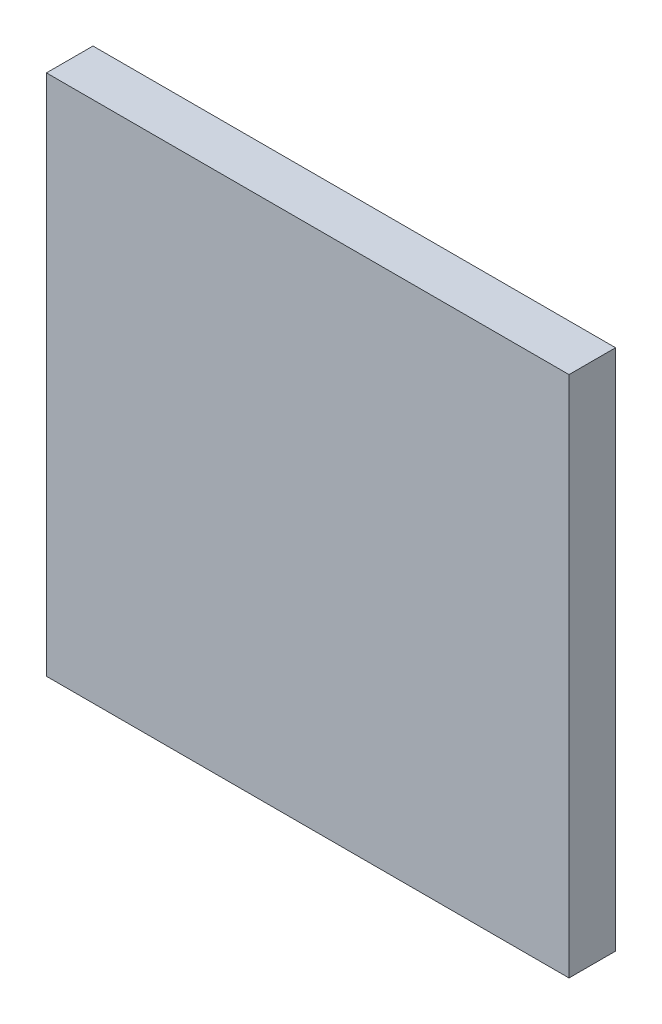
ISO-10303-21;
HEADER;
FILE_DESCRIPTION(('STEP AP214'),'2;1');
FILE_NAME('part.step','',(''),(''),'','','');
FILE_SCHEMA(('AUTOMOTIVE_DESIGN { 1 0 10303 214 1 1 1 1 }'));
ENDSEC;
DATA;
#1=APPLICATION_CONTEXT('core data for automotive mechanical design processes');
#2=APPLICATION_PROTOCOL_DEFINITION('international standard','automotive_design',2000,#1);
#3=PRODUCT_CONTEXT('',#1,'mechanical');
#4=PRODUCT('Part','Part','',(#3));
#5=PRODUCT_RELATED_PRODUCT_CATEGORY('part','',(#4));
#6=PRODUCT_DEFINITION_FORMATION('','',#4);
#7=PRODUCT_DEFINITION_CONTEXT('part definition',#1,'design');
#8=PRODUCT_DEFINITION('design','',#6,#7);
#9=PRODUCT_DEFINITION_SHAPE('','',#8);
#10=(LENGTH_UNIT() NAMED_UNIT(*) SI_UNIT(.MILLI.,.METRE.));
#11=(NAMED_UNIT(*) PLANE_ANGLE_UNIT() SI_UNIT($,.RADIAN.));
#12=(NAMED_UNIT(*) SI_UNIT($,.STERADIAN.) SOLID_ANGLE_UNIT());
#13=UNCERTAINTY_MEASURE_WITH_UNIT(LENGTH_MEASURE(1.E-05),#10,'distance_accuracy_value','');
#14=(GEOMETRIC_REPRESENTATION_CONTEXT(3) GLOBAL_UNCERTAINTY_ASSIGNED_CONTEXT((#13)) GLOBAL_UNIT_ASSIGNED_CONTEXT((#10,
#11,#12)) REPRESENTATION_CONTEXT('',''));
#15=CARTESIAN_POINT('',(0.,0.,0.));
#16=DIRECTION('',(0.,0.,1.));
#17=DIRECTION('',(1.,0.,0.));
#18=AXIS2_PLACEMENT_3D('',#15,#16,#17);
#19=CARTESIAN_POINT('',(-60.19,-87.5,3.34));
#20=DIRECTION('',(-1.,0.,0.));
#21=DIRECTION('',(0.,0.,1.));
#22=AXIS2_PLACEMENT_3D('',#19,#20,#21);
#23=PLANE('',#22);
#24=DIRECTION('',(0.,1.,0.));
#25=VECTOR('',#24,1.);
#26=CARTESIAN_POINT('',(-60.19,-87.5,0.));
#27=LINE('',#26,#25);
#28=CARTESIAN_POINT('',(-60.19,-87.5,0.));
#29=VERTEX_POINT('',#28);
#30=CARTESIAN_POINT('',(-60.19,-50.,0.));
#31=VERTEX_POINT('',#30);
#32=EDGE_CURVE('E104',#29,#31,#27,.T.);
#33=ORIENTED_EDGE('',*,*,#32,.T.);
#34=DIRECTION('',(0.,0.,-1.));
#35=VECTOR('',#34,1.);
#36=CARTESIAN_POINT('',(-60.19,-50.,3.34));
#37=LINE('',#36,#35);
#38=CARTESIAN_POINT('',(-60.19,-50.,3.34));
#39=VERTEX_POINT('',#38);
#40=EDGE_CURVE('E11',#39,#31,#37,.T.);
#41=ORIENTED_EDGE('',*,*,#40,.F.);
#42=DIRECTION('',(0.,1.,0.));
#43=VECTOR('',#42,1.);
#44=CARTESIAN_POINT('',(-60.19,-87.5,3.34));
#45=LINE('',#44,#43);
#46=CARTESIAN_POINT('',(-60.19,-87.5,3.34));
#47=VERTEX_POINT('',#46);
#48=EDGE_CURVE('E92',#47,#39,#45,.T.);
#49=ORIENTED_EDGE('',*,*,#48,.F.);
#50=DIRECTION('',(0.,0.,-1.));
#51=VECTOR('',#50,1.);
#52=CARTESIAN_POINT('',(-60.19,-87.5,3.34));
#53=LINE('',#52,#51);
#54=EDGE_CURVE('E100',#47,#29,#53,.T.);
#55=ORIENTED_EDGE('',*,*,#54,.T.);
#56=EDGE_LOOP('',(#33,#41,#49,#55));
#57=FACE_BOUND('',#56,.T.);
#58=ADVANCED_FACE('F41',(#57),#23,.F.);
#59=CARTESIAN_POINT('',(-60.19,-50.,3.34));
#60=DIRECTION('',(0.,-1.,0.));
#61=DIRECTION('',(0.,0.,-1.));
#62=AXIS2_PLACEMENT_3D('',#59,#60,#61);
#63=PLANE('',#62);
#64=DIRECTION('',(-1.,0.,0.));
#65=VECTOR('',#64,1.);
#66=CARTESIAN_POINT('',(-60.19,-50.,0.));
#67=LINE('',#66,#65);
#68=CARTESIAN_POINT('',(-97.69,-50.,0.));
#69=VERTEX_POINT('',#68);
#70=EDGE_CURVE('E96',#31,#69,#67,.T.);
#71=ORIENTED_EDGE('',*,*,#70,.T.);
#72=DIRECTION('',(0.,0.,-1.));
#73=VECTOR('',#72,1.);
#74=CARTESIAN_POINT('',(-97.69,-50.,3.34));
#75=LINE('',#74,#73);
#76=CARTESIAN_POINT('',(-97.69,-50.,3.34));
#77=VERTEX_POINT('',#76);
#78=EDGE_CURVE('E49',#77,#69,#75,.T.);
#79=ORIENTED_EDGE('',*,*,#78,.F.);
#80=DIRECTION('',(-1.,0.,0.));
#81=VECTOR('',#80,1.);
#82=CARTESIAN_POINT('',(-60.19,-50.,3.34));
#83=LINE('',#82,#81);
#84=EDGE_CURVE('E87',#39,#77,#83,.T.);
#85=ORIENTED_EDGE('',*,*,#84,.F.);
#86=ORIENTED_EDGE('',*,*,#40,.T.);
#87=EDGE_LOOP('',(#71,#79,#85,#86));
#88=FACE_BOUND('',#87,.T.);
#89=ADVANCED_FACE('F95',(#88),#63,.F.);
#90=CARTESIAN_POINT('',(-97.69,-50.,3.34));
#91=DIRECTION('',(1.,0.,0.));
#92=DIRECTION('',(0.,0.,-1.));
#93=AXIS2_PLACEMENT_3D('',#90,#91,#92);
#94=PLANE('',#93);
#95=DIRECTION('',(0.,-1.,0.));
#96=VECTOR('',#95,1.);
#97=CARTESIAN_POINT('',(-97.69,-50.,0.));
#98=LINE('',#97,#96);
#99=CARTESIAN_POINT('',(-97.69,-87.5,0.));
#100=VERTEX_POINT('',#99);
#101=EDGE_CURVE('E74',#69,#100,#98,.T.);
#102=ORIENTED_EDGE('',*,*,#101,.T.);
#103=DIRECTION('',(0.,0.,-1.));
#104=VECTOR('',#103,1.);
#105=CARTESIAN_POINT('',(-97.69,-87.5,3.34));
#106=LINE('',#105,#104);
#107=CARTESIAN_POINT('',(-97.69,-87.5,3.34));
#108=VERTEX_POINT('',#107);
#109=EDGE_CURVE('E97',#108,#100,#106,.T.);
#110=ORIENTED_EDGE('',*,*,#109,.F.);
#111=DIRECTION('',(0.,-1.,0.));
#112=VECTOR('',#111,1.);
#113=CARTESIAN_POINT('',(-97.69,-50.,3.34));
#114=LINE('',#113,#112);
#115=EDGE_CURVE('E90',#77,#108,#114,.T.);
#116=ORIENTED_EDGE('',*,*,#115,.F.);
#117=ORIENTED_EDGE('',*,*,#78,.T.);
#118=EDGE_LOOP('',(#102,#110,#116,#117));
#119=FACE_BOUND('',#118,.T.);
#120=ADVANCED_FACE('F98',(#119),#94,.F.);
#121=CARTESIAN_POINT('',(-97.69,-87.5,3.34));
#122=DIRECTION('',(0.,1.,0.));
#123=DIRECTION('',(0.,0.,1.));
#124=AXIS2_PLACEMENT_3D('',#121,#122,#123);
#125=PLANE('',#124);
#126=DIRECTION('',(1.,0.,0.));
#127=VECTOR('',#126,1.);
#128=CARTESIAN_POINT('',(-97.69,-87.5,0.));
#129=LINE('',#128,#127);
#130=EDGE_CURVE('E80',#100,#29,#129,.T.);
#131=ORIENTED_EDGE('',*,*,#130,.T.);
#132=ORIENTED_EDGE('',*,*,#54,.F.);
#133=DIRECTION('',(1.,0.,0.));
#134=VECTOR('',#133,1.);
#135=CARTESIAN_POINT('',(-97.69,-87.5,3.34));
#136=LINE('',#135,#134);
#137=EDGE_CURVE('E57',#108,#47,#136,.T.);
#138=ORIENTED_EDGE('',*,*,#137,.F.);
#139=ORIENTED_EDGE('',*,*,#109,.T.);
#140=EDGE_LOOP('',(#131,#132,#138,#139));
#141=FACE_BOUND('',#140,.T.);
#142=ADVANCED_FACE('F111',(#141),#125,.F.);
#143=CARTESIAN_POINT('',(-60.19,-50.,3.34));
#144=DIRECTION('',(0.,0.,1.));
#145=DIRECTION('',(1.,0.,0.));
#146=AXIS2_PLACEMENT_3D('',#143,#144,#145);
#147=PLANE('',#146);
#148=ORIENTED_EDGE('',*,*,#48,.T.);
#149=ORIENTED_EDGE('',*,*,#84,.T.);
#150=ORIENTED_EDGE('',*,*,#115,.T.);
#151=ORIENTED_EDGE('',*,*,#137,.T.);
#152=EDGE_LOOP('',(#148,#149,#150,#151));
#153=FACE_BOUND('',#152,.T.);
#154=ADVANCED_FACE('F88',(#153),#147,.T.);
#155=CARTESIAN_POINT('',(-60.19,-50.,0.));
#156=DIRECTION('',(0.,0.,1.));
#157=DIRECTION('',(1.,0.,0.));
#158=AXIS2_PLACEMENT_3D('',#155,#156,#157);
#159=PLANE('',#158);
#160=ORIENTED_EDGE('',*,*,#32,.F.);
#161=ORIENTED_EDGE('',*,*,#130,.F.);
#162=ORIENTED_EDGE('',*,*,#101,.F.);
#163=ORIENTED_EDGE('',*,*,#70,.F.);
#164=EDGE_LOOP('',(#160,#161,#162,#163));
#165=FACE_BOUND('',#164,.T.);
#166=ADVANCED_FACE('F114',(#165),#159,.F.);
#167=CLOSED_SHELL('',(#58,#89,#120,#142,#154,#166));
#168=MANIFOLD_SOLID_BREP('B2',#167);
#169=ADVANCED_BREP_SHAPE_REPRESENTATION('',(#18,#168),#14);
#170=SHAPE_DEFINITION_REPRESENTATION(#9,#169);
ENDSEC;
END-ISO-10303-21;
